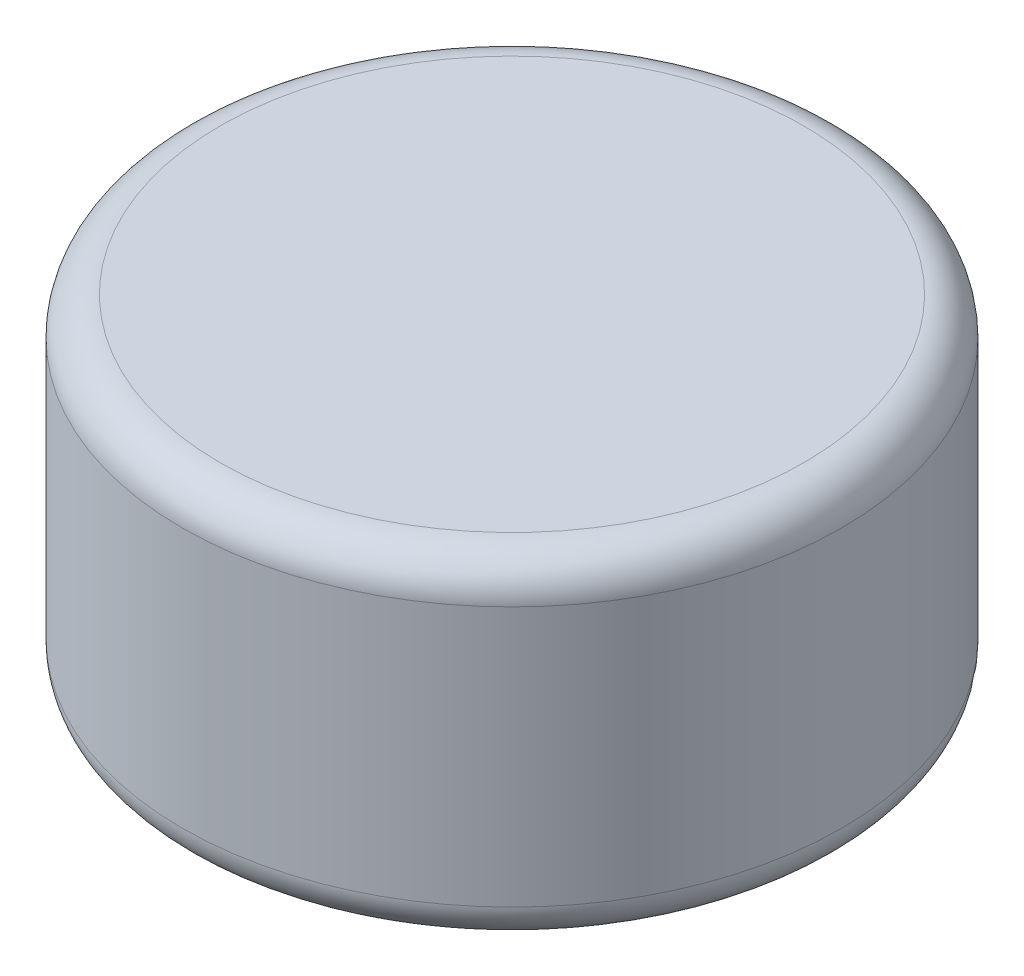
ISO-10303-21;
HEADER;
FILE_DESCRIPTION(('STEP AP214'),'2;1');
FILE_NAME('part.step','',(''),(''),'','','');
FILE_SCHEMA(('AUTOMOTIVE_DESIGN { 1 0 10303 214 1 1 1 1 }'));
ENDSEC;
DATA;
#1=APPLICATION_CONTEXT('core data for automotive mechanical design processes');
#2=APPLICATION_PROTOCOL_DEFINITION('international standard','automotive_design',2000,#1);
#3=PRODUCT_CONTEXT('',#1,'mechanical');
#4=PRODUCT('Part','Part','',(#3));
#5=PRODUCT_RELATED_PRODUCT_CATEGORY('part','',(#4));
#6=PRODUCT_DEFINITION_FORMATION('','',#4);
#7=PRODUCT_DEFINITION_CONTEXT('part definition',#1,'design');
#8=PRODUCT_DEFINITION('design','',#6,#7);
#9=PRODUCT_DEFINITION_SHAPE('','',#8);
#10=(LENGTH_UNIT() NAMED_UNIT(*) SI_UNIT(.MILLI.,.METRE.));
#11=(NAMED_UNIT(*) PLANE_ANGLE_UNIT() SI_UNIT($,.RADIAN.));
#12=(NAMED_UNIT(*) SI_UNIT($,.STERADIAN.) SOLID_ANGLE_UNIT());
#13=UNCERTAINTY_MEASURE_WITH_UNIT(LENGTH_MEASURE(1.E-05),#10,'distance_accuracy_value','');
#14=(GEOMETRIC_REPRESENTATION_CONTEXT(3) GLOBAL_UNCERTAINTY_ASSIGNED_CONTEXT((#13)) GLOBAL_UNIT_ASSIGNED_CONTEXT((#10,
#11,#12)) REPRESENTATION_CONTEXT('',''));
#15=CARTESIAN_POINT('',(0.,0.,0.));
#16=DIRECTION('',(0.,0.,1.));
#17=DIRECTION('',(1.,0.,0.));
#18=AXIS2_PLACEMENT_3D('',#15,#16,#17);
#19=CARTESIAN_POINT('',(0.,355.6,0.));
#20=DIRECTION('',(0.,-1.,0.));
#21=DIRECTION('',(0.,0.,-1.));
#22=AXIS2_PLACEMENT_3D('',#19,#20,#21);
#23=CYLINDRICAL_SURFACE('',#22,349.25);
#24=CARTESIAN_POINT('',(0.,40.,0.));
#25=DIRECTION('',(0.,1.,0.));
#26=DIRECTION('',(0.,0.,1.));
#27=AXIS2_PLACEMENT_3D('',#24,#25,#26);
#28=CIRCLE('',#27,349.25);
#29=CARTESIAN_POINT('',(0.,40.,349.25));
#30=VERTEX_POINT('',#29);
#31=EDGE_CURVE('E56',#30,#30,#28,.T.);
#32=ORIENTED_EDGE('',*,*,#31,.T.);
#33=EDGE_LOOP('',(#32));
#34=FACE_BOUND('',#33,.T.);
#35=CARTESIAN_POINT('',(0.,315.6,0.));
#36=DIRECTION('',(0.,1.,0.));
#37=DIRECTION('',(0.,0.,1.));
#38=AXIS2_PLACEMENT_3D('',#35,#36,#37);
#39=CIRCLE('',#38,349.25);
#40=CARTESIAN_POINT('',(0.,315.6,349.25));
#41=VERTEX_POINT('',#40);
#42=EDGE_CURVE('E60',#41,#41,#39,.F.);
#43=ORIENTED_EDGE('',*,*,#42,.T.);
#44=EDGE_LOOP('',(#43));
#45=FACE_BOUND('',#44,.T.);
#46=ADVANCED_FACE('F45',(#34,#45),#23,.T.);
#47=CARTESIAN_POINT('',(0.,355.6,0.));
#48=DIRECTION('',(0.,1.,0.));
#49=DIRECTION('',(0.,0.,1.));
#50=AXIS2_PLACEMENT_3D('',#47,#48,#49);
#51=PLANE('',#50);
#52=CARTESIAN_POINT('',(0.,355.6,0.));
#53=DIRECTION('',(0.,1.,0.));
#54=DIRECTION('',(0.,0.,1.));
#55=AXIS2_PLACEMENT_3D('',#52,#53,#54);
#56=CIRCLE('',#55,309.25);
#57=CARTESIAN_POINT('',(0.,355.6,309.25));
#58=VERTEX_POINT('',#57);
#59=EDGE_CURVE('E10',#58,#58,#56,.T.);
#60=ORIENTED_EDGE('',*,*,#59,.T.);
#61=EDGE_LOOP('',(#60));
#62=FACE_BOUND('',#61,.T.);
#63=ADVANCED_FACE('F83',(#62),#51,.T.);
#64=CARTESIAN_POINT('',(0.,0.,0.));
#65=DIRECTION('',(0.,1.,0.));
#66=DIRECTION('',(0.,0.,1.));
#67=AXIS2_PLACEMENT_3D('',#64,#65,#66);
#68=PLANE('',#67);
#69=CARTESIAN_POINT('',(0.,0.,0.));
#70=DIRECTION('',(0.,-1.,0.));
#71=DIRECTION('',(0.,0.,-1.));
#72=AXIS2_PLACEMENT_3D('',#69,#70,#71);
#73=CIRCLE('',#72,65.5);
#74=CARTESIAN_POINT('',(0.,0.,-65.5));
#75=VERTEX_POINT('',#74);
#76=EDGE_CURVE('E66',#75,#75,#73,.T.);
#77=ORIENTED_EDGE('',*,*,#76,.F.);
#78=EDGE_LOOP('',(#77));
#79=FACE_BOUND('',#78,.T.);
#80=CARTESIAN_POINT('',(0.,0.,0.));
#81=DIRECTION('',(0.,1.,0.));
#82=DIRECTION('',(0.,0.,1.));
#83=AXIS2_PLACEMENT_3D('',#80,#81,#82);
#84=CIRCLE('',#83,309.25);
#85=CARTESIAN_POINT('',(0.,0.,309.25));
#86=VERTEX_POINT('',#85);
#87=EDGE_CURVE('E52',#86,#86,#84,.F.);
#88=ORIENTED_EDGE('',*,*,#87,.T.);
#89=EDGE_LOOP('',(#88));
#90=FACE_BOUND('',#89,.T.);
#91=ADVANCED_FACE('F80',(#79,#90),#68,.F.);
#92=CARTESIAN_POINT('',(0.,40.,0.));
#93=DIRECTION('',(0.,1.,0.));
#94=DIRECTION('',(0.,0.,1.));
#95=AXIS2_PLACEMENT_3D('',#92,#93,#94);
#96=TOROIDAL_SURFACE('',#95,309.25,40.);
#97=ORIENTED_EDGE('',*,*,#87,.F.);
#98=EDGE_LOOP('',(#97));
#99=FACE_BOUND('',#98,.T.);
#100=ORIENTED_EDGE('',*,*,#31,.F.);
#101=EDGE_LOOP('',(#100));
#102=FACE_BOUND('',#101,.T.);
#103=ADVANCED_FACE('F82',(#99,#102),#96,.T.);
#104=CARTESIAN_POINT('',(0.,315.6,0.));
#105=DIRECTION('',(0.,1.,0.));
#106=DIRECTION('',(0.,0.,1.));
#107=AXIS2_PLACEMENT_3D('',#104,#105,#106);
#108=TOROIDAL_SURFACE('',#107,309.25,40.);
#109=ORIENTED_EDGE('',*,*,#42,.F.);
#110=EDGE_LOOP('',(#109));
#111=FACE_BOUND('',#110,.T.);
#112=ORIENTED_EDGE('',*,*,#59,.F.);
#113=EDGE_LOOP('',(#112));
#114=FACE_BOUND('',#113,.T.);
#115=ADVANCED_FACE('F47',(#111,#114),#108,.T.);
#116=CARTESIAN_POINT('',(0.,136.,0.));
#117=DIRECTION('',(0.,-1.,0.));
#118=DIRECTION('',(0.,0.,-1.));
#119=AXIS2_PLACEMENT_3D('',#116,#117,#118);
#120=CYLINDRICAL_SURFACE('',#119,65.5);
#121=CARTESIAN_POINT('',(0.,136.,0.));
#122=DIRECTION('',(0.,-1.,0.));
#123=DIRECTION('',(0.,0.,-1.));
#124=AXIS2_PLACEMENT_3D('',#121,#122,#123);
#125=CIRCLE('',#124,65.5);
#126=CARTESIAN_POINT('',(0.,136.,-65.5));
#127=VERTEX_POINT('',#126);
#128=EDGE_CURVE('E65',#127,#127,#125,.T.);
#129=ORIENTED_EDGE('',*,*,#128,.F.);
#130=EDGE_LOOP('',(#129));
#131=FACE_BOUND('',#130,.T.);
#132=ORIENTED_EDGE('',*,*,#76,.T.);
#133=EDGE_LOOP('',(#132));
#134=FACE_BOUND('',#133,.T.);
#135=ADVANCED_FACE('F74',(#131,#134),#120,.F.);
#136=CARTESIAN_POINT('',(0.,136.,0.));
#137=DIRECTION('',(0.,-1.,0.));
#138=DIRECTION('',(0.,0.,-1.));
#139=AXIS2_PLACEMENT_3D('',#136,#137,#138);
#140=PLANE('',#139);
#141=ORIENTED_EDGE('',*,*,#128,.T.);
#142=EDGE_LOOP('',(#141));
#143=FACE_BOUND('',#142,.T.);
#144=ADVANCED_FACE('F72',(#143),#140,.T.);
#145=CLOSED_SHELL('',(#46,#63,#91,#103,#115,#135,#144));
#146=MANIFOLD_SOLID_BREP('B2',#145);
#147=ADVANCED_BREP_SHAPE_REPRESENTATION('',(#18,#146),#14);
#148=SHAPE_DEFINITION_REPRESENTATION(#9,#147);
ENDSEC;
END-ISO-10303-21;
